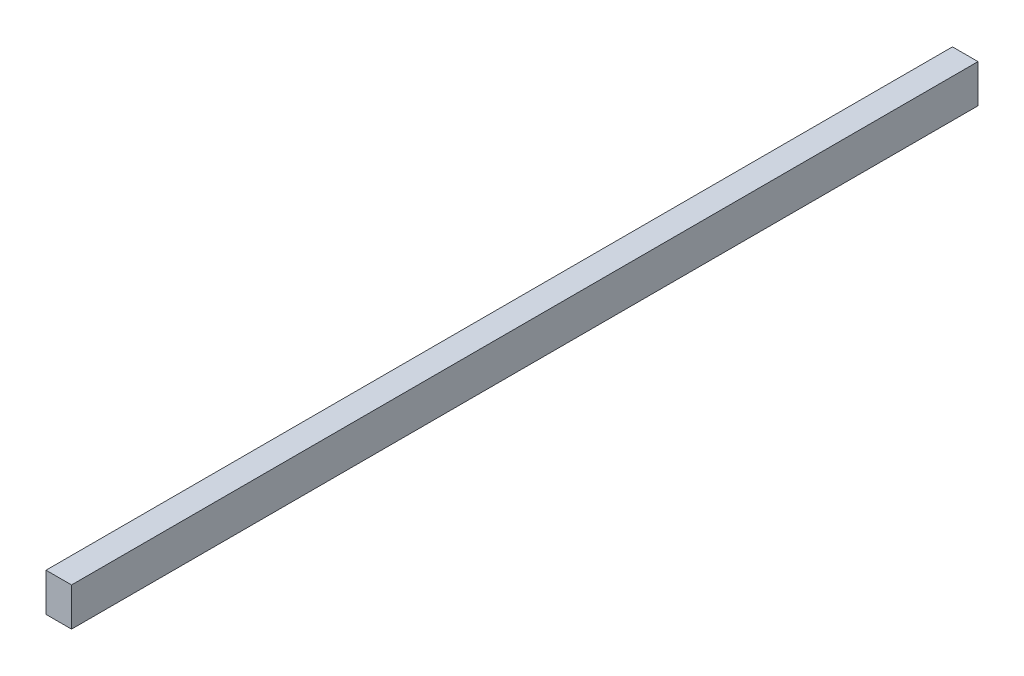
ISO-10303-21;
HEADER;
FILE_DESCRIPTION(('STEP AP214'),'2;1');
FILE_NAME('part.step','',(''),(''),'','','');
FILE_SCHEMA(('AUTOMOTIVE_DESIGN { 1 0 10303 214 1 1 1 1 }'));
ENDSEC;
DATA;
#1=APPLICATION_CONTEXT('core data for automotive mechanical design processes');
#2=APPLICATION_PROTOCOL_DEFINITION('international standard','automotive_design',2000,#1);
#3=PRODUCT_CONTEXT('',#1,'mechanical');
#4=PRODUCT('Part','Part','',(#3));
#5=PRODUCT_RELATED_PRODUCT_CATEGORY('part','',(#4));
#6=PRODUCT_DEFINITION_FORMATION('','',#4);
#7=PRODUCT_DEFINITION_CONTEXT('part definition',#1,'design');
#8=PRODUCT_DEFINITION('design','',#6,#7);
#9=PRODUCT_DEFINITION_SHAPE('','',#8);
#10=(LENGTH_UNIT() NAMED_UNIT(*) SI_UNIT(.MILLI.,.METRE.));
#11=(NAMED_UNIT(*) PLANE_ANGLE_UNIT() SI_UNIT($,.RADIAN.));
#12=(NAMED_UNIT(*) SI_UNIT($,.STERADIAN.) SOLID_ANGLE_UNIT());
#13=UNCERTAINTY_MEASURE_WITH_UNIT(LENGTH_MEASURE(1.E-05),#10,'distance_accuracy_value','');
#14=(GEOMETRIC_REPRESENTATION_CONTEXT(3) GLOBAL_UNCERTAINTY_ASSIGNED_CONTEXT((#13)) GLOBAL_UNIT_ASSIGNED_CONTEXT((#10,
#11,#12)) REPRESENTATION_CONTEXT('',''));
#15=CARTESIAN_POINT('',(0.,0.,0.));
#16=DIRECTION('',(0.,0.,1.));
#17=DIRECTION('',(1.,0.,0.));
#18=AXIS2_PLACEMENT_3D('',#15,#16,#17);
#19=CARTESIAN_POINT('',(12.,0.,0.));
#20=DIRECTION('',(0.,0.,-1.));
#21=DIRECTION('',(-1.,0.,0.));
#22=AXIS2_PLACEMENT_3D('',#19,#20,#21);
#23=PLANE('',#22);
#24=DIRECTION('',(0.,-1.,0.));
#25=VECTOR('',#24,1.);
#26=CARTESIAN_POINT('',(0.,0.,0.));
#27=LINE('',#26,#25);
#28=CARTESIAN_POINT('',(0.,18.,0.));
#29=VERTEX_POINT('',#28);
#30=CARTESIAN_POINT('',(0.,0.,0.));
#31=VERTEX_POINT('',#30);
#32=EDGE_CURVE('E96',#29,#31,#27,.T.);
#33=ORIENTED_EDGE('',*,*,#32,.T.);
#34=DIRECTION('',(-1.,0.,0.));
#35=VECTOR('',#34,1.);
#36=CARTESIAN_POINT('',(12.,0.,0.));
#37=LINE('',#36,#35);
#38=CARTESIAN_POINT('',(12.,0.,0.));
#39=VERTEX_POINT('',#38);
#40=EDGE_CURVE('E11',#39,#31,#37,.T.);
#41=ORIENTED_EDGE('',*,*,#40,.F.);
#42=DIRECTION('',(0.,-1.,0.));
#43=VECTOR('',#42,1.);
#44=CARTESIAN_POINT('',(12.,0.,0.));
#45=LINE('',#44,#43);
#46=CARTESIAN_POINT('',(12.,18.,0.));
#47=VERTEX_POINT('',#46);
#48=EDGE_CURVE('E84',#47,#39,#45,.T.);
#49=ORIENTED_EDGE('',*,*,#48,.F.);
#50=DIRECTION('',(-1.,0.,0.));
#51=VECTOR('',#50,1.);
#52=CARTESIAN_POINT('',(12.,18.,0.));
#53=LINE('',#52,#51);
#54=EDGE_CURVE('E92',#47,#29,#53,.T.);
#55=ORIENTED_EDGE('',*,*,#54,.T.);
#56=EDGE_LOOP('',(#33,#41,#49,#55));
#57=FACE_BOUND('',#56,.T.);
#58=ADVANCED_FACE('F33',(#57),#23,.F.);
#59=CARTESIAN_POINT('',(12.,0.,0.));
#60=DIRECTION('',(0.,1.,0.));
#61=DIRECTION('',(0.,0.,1.));
#62=AXIS2_PLACEMENT_3D('',#59,#60,#61);
#63=PLANE('',#62);
#64=DIRECTION('',(0.,0.,-1.));
#65=VECTOR('',#64,1.);
#66=CARTESIAN_POINT('',(0.,0.,0.));
#67=LINE('',#66,#65);
#68=CARTESIAN_POINT('',(0.,0.,-426.));
#69=VERTEX_POINT('',#68);
#70=EDGE_CURVE('E88',#31,#69,#67,.T.);
#71=ORIENTED_EDGE('',*,*,#70,.T.);
#72=DIRECTION('',(-1.,0.,0.));
#73=VECTOR('',#72,1.);
#74=CARTESIAN_POINT('',(12.,0.,-426.));
#75=LINE('',#74,#73);
#76=CARTESIAN_POINT('',(12.,0.,-426.));
#77=VERTEX_POINT('',#76);
#78=EDGE_CURVE('E41',#77,#69,#75,.T.);
#79=ORIENTED_EDGE('',*,*,#78,.F.);
#80=DIRECTION('',(0.,0.,-1.));
#81=VECTOR('',#80,1.);
#82=CARTESIAN_POINT('',(12.,0.,0.));
#83=LINE('',#82,#81);
#84=EDGE_CURVE('E79',#39,#77,#83,.T.);
#85=ORIENTED_EDGE('',*,*,#84,.F.);
#86=ORIENTED_EDGE('',*,*,#40,.T.);
#87=EDGE_LOOP('',(#71,#79,#85,#86));
#88=FACE_BOUND('',#87,.T.);
#89=ADVANCED_FACE('F87',(#88),#63,.F.);
#90=CARTESIAN_POINT('',(12.,0.,-426.));
#91=DIRECTION('',(0.,0.,1.));
#92=DIRECTION('',(1.,0.,0.));
#93=AXIS2_PLACEMENT_3D('',#90,#91,#92);
#94=PLANE('',#93);
#95=DIRECTION('',(0.,1.,0.));
#96=VECTOR('',#95,1.);
#97=CARTESIAN_POINT('',(0.,0.,-426.));
#98=LINE('',#97,#96);
#99=CARTESIAN_POINT('',(0.,18.,-426.));
#100=VERTEX_POINT('',#99);
#101=EDGE_CURVE('E66',#69,#100,#98,.T.);
#102=ORIENTED_EDGE('',*,*,#101,.T.);
#103=DIRECTION('',(-1.,0.,0.));
#104=VECTOR('',#103,1.);
#105=CARTESIAN_POINT('',(12.,18.,-426.));
#106=LINE('',#105,#104);
#107=CARTESIAN_POINT('',(12.,18.,-426.));
#108=VERTEX_POINT('',#107);
#109=EDGE_CURVE('E89',#108,#100,#106,.T.);
#110=ORIENTED_EDGE('',*,*,#109,.F.);
#111=DIRECTION('',(0.,1.,0.));
#112=VECTOR('',#111,1.);
#113=CARTESIAN_POINT('',(12.,0.,-426.));
#114=LINE('',#113,#112);
#115=EDGE_CURVE('E82',#77,#108,#114,.T.);
#116=ORIENTED_EDGE('',*,*,#115,.F.);
#117=ORIENTED_EDGE('',*,*,#78,.T.);
#118=EDGE_LOOP('',(#102,#110,#116,#117));
#119=FACE_BOUND('',#118,.T.);
#120=ADVANCED_FACE('F90',(#119),#94,.F.);
#121=CARTESIAN_POINT('',(12.,18.,0.));
#122=DIRECTION('',(0.,-1.,0.));
#123=DIRECTION('',(0.,0.,-1.));
#124=AXIS2_PLACEMENT_3D('',#121,#122,#123);
#125=PLANE('',#124);
#126=DIRECTION('',(0.,0.,1.));
#127=VECTOR('',#126,1.);
#128=CARTESIAN_POINT('',(0.,18.,0.));
#129=LINE('',#128,#127);
#130=EDGE_CURVE('E72',#100,#29,#129,.T.);
#131=ORIENTED_EDGE('',*,*,#130,.T.);
#132=ORIENTED_EDGE('',*,*,#54,.F.);
#133=DIRECTION('',(0.,0.,1.));
#134=VECTOR('',#133,1.);
#135=CARTESIAN_POINT('',(12.,18.,0.));
#136=LINE('',#135,#134);
#137=EDGE_CURVE('E49',#108,#47,#136,.T.);
#138=ORIENTED_EDGE('',*,*,#137,.F.);
#139=ORIENTED_EDGE('',*,*,#109,.T.);
#140=EDGE_LOOP('',(#131,#132,#138,#139));
#141=FACE_BOUND('',#140,.T.);
#142=ADVANCED_FACE('F103',(#141),#125,.F.);
#143=CARTESIAN_POINT('',(12.,0.,0.));
#144=DIRECTION('',(-1.,0.,0.));
#145=DIRECTION('',(0.,0.,1.));
#146=AXIS2_PLACEMENT_3D('',#143,#144,#145);
#147=PLANE('',#146);
#148=ORIENTED_EDGE('',*,*,#48,.T.);
#149=ORIENTED_EDGE('',*,*,#84,.T.);
#150=ORIENTED_EDGE('',*,*,#115,.T.);
#151=ORIENTED_EDGE('',*,*,#137,.T.);
#152=EDGE_LOOP('',(#148,#149,#150,#151));
#153=FACE_BOUND('',#152,.T.);
#154=ADVANCED_FACE('F80',(#153),#147,.F.);
#155=CARTESIAN_POINT('',(0.,0.,0.));
#156=DIRECTION('',(-1.,0.,0.));
#157=DIRECTION('',(0.,0.,1.));
#158=AXIS2_PLACEMENT_3D('',#155,#156,#157);
#159=PLANE('',#158);
#160=ORIENTED_EDGE('',*,*,#32,.F.);
#161=ORIENTED_EDGE('',*,*,#130,.F.);
#162=ORIENTED_EDGE('',*,*,#101,.F.);
#163=ORIENTED_EDGE('',*,*,#70,.F.);
#164=EDGE_LOOP('',(#160,#161,#162,#163));
#165=FACE_BOUND('',#164,.T.);
#166=ADVANCED_FACE('F106',(#165),#159,.T.);
#167=CLOSED_SHELL('',(#58,#89,#120,#142,#154,#166));
#168=MANIFOLD_SOLID_BREP('B2',#167);
#169=ADVANCED_BREP_SHAPE_REPRESENTATION('',(#18,#168),#14);
#170=SHAPE_DEFINITION_REPRESENTATION(#9,#169);
ENDSEC;
END-ISO-10303-21;
